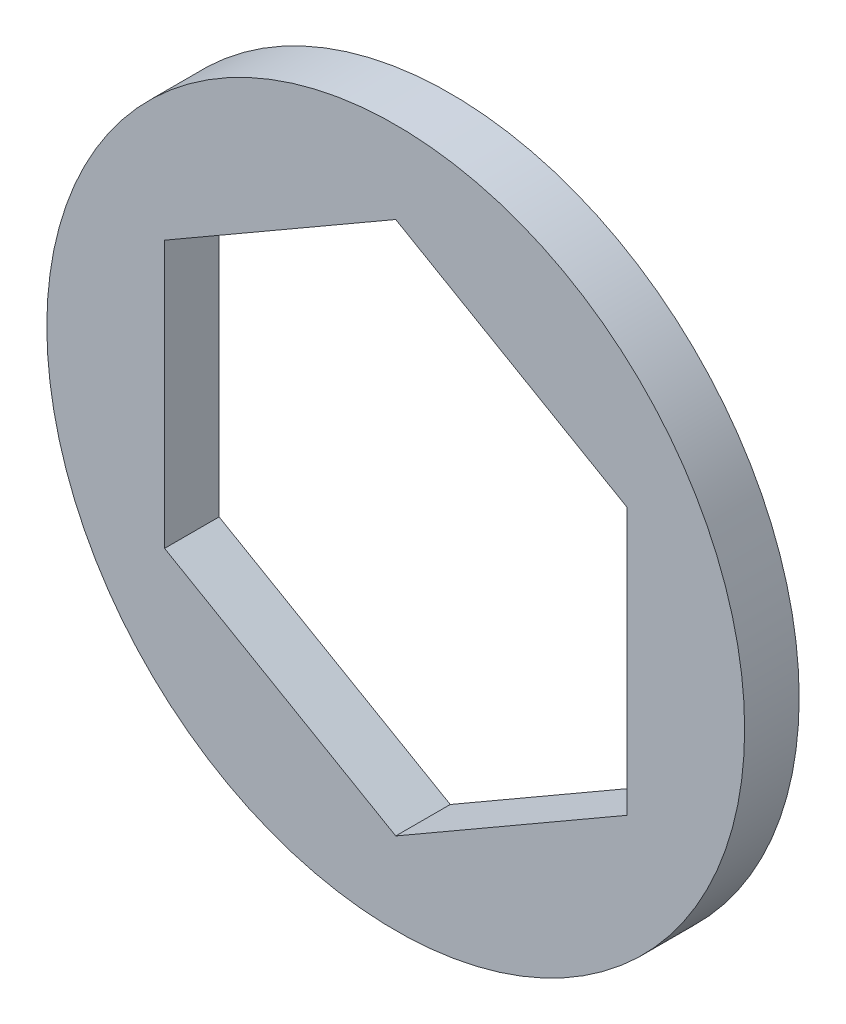
ISO-10303-21;
HEADER;
FILE_DESCRIPTION(('STEP AP214'),'2;1');
FILE_NAME('part.step','',(''),(''),'','','');
FILE_SCHEMA(('AUTOMOTIVE_DESIGN { 1 0 10303 214 1 1 1 1 }'));
ENDSEC;
DATA;
#1=APPLICATION_CONTEXT('core data for automotive mechanical design processes');
#2=APPLICATION_PROTOCOL_DEFINITION('international standard','automotive_design',2000,#1);
#3=PRODUCT_CONTEXT('',#1,'mechanical');
#4=PRODUCT('Part','Part','',(#3));
#5=PRODUCT_RELATED_PRODUCT_CATEGORY('part','',(#4));
#6=PRODUCT_DEFINITION_FORMATION('','',#4);
#7=PRODUCT_DEFINITION_CONTEXT('part definition',#1,'design');
#8=PRODUCT_DEFINITION('design','',#6,#7);
#9=PRODUCT_DEFINITION_SHAPE('','',#8);
#10=(LENGTH_UNIT() NAMED_UNIT(*) SI_UNIT(.MILLI.,.METRE.));
#11=(NAMED_UNIT(*) PLANE_ANGLE_UNIT() SI_UNIT($,.RADIAN.));
#12=(NAMED_UNIT(*) SI_UNIT($,.STERADIAN.) SOLID_ANGLE_UNIT());
#13=UNCERTAINTY_MEASURE_WITH_UNIT(LENGTH_MEASURE(1.E-05),#10,'distance_accuracy_value','');
#14=(GEOMETRIC_REPRESENTATION_CONTEXT(3) GLOBAL_UNCERTAINTY_ASSIGNED_CONTEXT((#13)) GLOBAL_UNIT_ASSIGNED_CONTEXT((#10,
#11,#12)) REPRESENTATION_CONTEXT('',''));
#15=CARTESIAN_POINT('',(0.,0.,0.));
#16=DIRECTION('',(0.,0.,1.));
#17=DIRECTION('',(1.,0.,0.));
#18=AXIS2_PLACEMENT_3D('',#15,#16,#17);
#19=CARTESIAN_POINT('',(0.,0.,0.79375));
#20=DIRECTION('',(0.,0.,1.));
#21=DIRECTION('',(1.,0.,0.));
#22=AXIS2_PLACEMENT_3D('',#19,#20,#21);
#23=PLANE('',#22);
#24=CARTESIAN_POINT('',(0.,0.,0.79375));
#25=DIRECTION('',(0.,0.,1.));
#26=DIRECTION('',(1.,0.,0.));
#27=AXIS2_PLACEMENT_3D('',#24,#25,#26);
#28=CIRCLE('',#27,10.16);
#29=CARTESIAN_POINT('',(10.16,0.,0.79375));
#30=VERTEX_POINT('',#29);
#31=EDGE_CURVE('E11',#30,#30,#28,.T.);
#32=ORIENTED_EDGE('',*,*,#31,.T.);
#33=EDGE_LOOP('',(#32));
#34=FACE_BOUND('',#33,.T.);
#35=DIRECTION('',(-0.866025403784438,-0.5,0.));
#36=VECTOR('',#35,1.);
#37=CARTESIAN_POINT('',(0.,7.77228932383074,0.79375));
#38=LINE('',#37,#36);
#39=CARTESIAN_POINT('',(0.,7.77228932383074,0.79375));
#40=VERTEX_POINT('',#39);
#41=CARTESIAN_POINT('',(-6.731,3.88614466191537,0.79375));
#42=VERTEX_POINT('',#41);
#43=EDGE_CURVE('E102',#40,#42,#38,.T.);
#44=ORIENTED_EDGE('',*,*,#43,.F.);
#45=DIRECTION('',(-0.866025403784439,0.5,0.));
#46=VECTOR('',#45,1.);
#47=CARTESIAN_POINT('',(6.731,3.88614466191537,0.79375));
#48=LINE('',#47,#46);
#49=CARTESIAN_POINT('',(6.731,3.88614466191537,0.79375));
#50=VERTEX_POINT('',#49);
#51=EDGE_CURVE('E94',#50,#40,#48,.T.);
#52=ORIENTED_EDGE('',*,*,#51,.F.);
#53=DIRECTION('',(0.,1.,0.));
#54=VECTOR('',#53,1.);
#55=CARTESIAN_POINT('',(6.731,-3.88614466191537,0.79375));
#56=LINE('',#55,#54);
#57=CARTESIAN_POINT('',(6.731,-3.88614466191537,0.79375));
#58=VERTEX_POINT('',#57);
#59=EDGE_CURVE('E122',#58,#50,#56,.T.);
#60=ORIENTED_EDGE('',*,*,#59,.F.);
#61=DIRECTION('',(0.866025403784439,0.5,0.));
#62=VECTOR('',#61,1.);
#63=CARTESIAN_POINT('',(0.,-7.77228932383074,0.79375));
#64=LINE('',#63,#62);
#65=CARTESIAN_POINT('',(0.,-7.77228932383074,0.79375));
#66=VERTEX_POINT('',#65);
#67=EDGE_CURVE('E120',#66,#58,#64,.T.);
#68=ORIENTED_EDGE('',*,*,#67,.F.);
#69=DIRECTION('',(0.866025403784439,-0.5,0.));
#70=VECTOR('',#69,1.);
#71=CARTESIAN_POINT('',(-6.731,-3.88614466191537,0.79375));
#72=LINE('',#71,#70);
#73=CARTESIAN_POINT('',(-6.731,-3.88614466191537,0.79375));
#74=VERTEX_POINT('',#73);
#75=EDGE_CURVE('E116',#74,#66,#72,.T.);
#76=ORIENTED_EDGE('',*,*,#75,.F.);
#77=DIRECTION('',(0.,-1.,0.));
#78=VECTOR('',#77,1.);
#79=CARTESIAN_POINT('',(-6.731,3.88614466191537,0.79375));
#80=LINE('',#79,#78);
#81=EDGE_CURVE('E114',#42,#74,#80,.T.);
#82=ORIENTED_EDGE('',*,*,#81,.F.);
#83=EDGE_LOOP('',(#44,#52,#60,#68,#76,#82));
#84=FACE_BOUND('',#83,.T.);
#85=ADVANCED_FACE('F41',(#34,#84),#23,.T.);
#86=CARTESIAN_POINT('',(0.,0.,-0.79375));
#87=DIRECTION('',(0.,0.,1.));
#88=DIRECTION('',(1.,0.,0.));
#89=AXIS2_PLACEMENT_3D('',#86,#87,#88);
#90=PLANE('',#89);
#91=CARTESIAN_POINT('',(0.,0.,-0.79375));
#92=DIRECTION('',(0.,0.,1.));
#93=DIRECTION('',(1.,0.,0.));
#94=AXIS2_PLACEMENT_3D('',#91,#92,#93);
#95=CIRCLE('',#94,10.16);
#96=CARTESIAN_POINT('',(10.16,0.,-0.79375));
#97=VERTEX_POINT('',#96);
#98=EDGE_CURVE('E45',#97,#97,#95,.T.);
#99=ORIENTED_EDGE('',*,*,#98,.F.);
#100=EDGE_LOOP('',(#99));
#101=FACE_BOUND('',#100,.T.);
#102=DIRECTION('',(-0.866025403784439,0.5,0.));
#103=VECTOR('',#102,1.);
#104=CARTESIAN_POINT('',(6.731,3.88614466191537,-0.79375));
#105=LINE('',#104,#103);
#106=CARTESIAN_POINT('',(6.731,3.88614466191537,-0.79375));
#107=VERTEX_POINT('',#106);
#108=CARTESIAN_POINT('',(0.,7.77228932383074,-0.79375));
#109=VERTEX_POINT('',#108);
#110=EDGE_CURVE('E64',#107,#109,#105,.T.);
#111=ORIENTED_EDGE('',*,*,#110,.T.);
#112=DIRECTION('',(-0.866025403784438,-0.5,0.));
#113=VECTOR('',#112,1.);
#114=CARTESIAN_POINT('',(0.,7.77228932383074,-0.79375));
#115=LINE('',#114,#113);
#116=CARTESIAN_POINT('',(-6.731,3.88614466191537,-0.79375));
#117=VERTEX_POINT('',#116);
#118=EDGE_CURVE('E109',#109,#117,#115,.T.);
#119=ORIENTED_EDGE('',*,*,#118,.T.);
#120=DIRECTION('',(0.,-1.,0.));
#121=VECTOR('',#120,1.);
#122=CARTESIAN_POINT('',(-6.731,3.88614466191537,-0.79375));
#123=LINE('',#122,#121);
#124=CARTESIAN_POINT('',(-6.731,-3.88614466191537,-0.79375));
#125=VERTEX_POINT('',#124);
#126=EDGE_CURVE('E126',#117,#125,#123,.T.);
#127=ORIENTED_EDGE('',*,*,#126,.T.);
#128=DIRECTION('',(0.866025403784439,-0.5,0.));
#129=VECTOR('',#128,1.);
#130=CARTESIAN_POINT('',(-6.731,-3.88614466191537,-0.79375));
#131=LINE('',#130,#129);
#132=CARTESIAN_POINT('',(0.,-7.77228932383074,-0.79375));
#133=VERTEX_POINT('',#132);
#134=EDGE_CURVE('E129',#125,#133,#131,.T.);
#135=ORIENTED_EDGE('',*,*,#134,.T.);
#136=DIRECTION('',(0.866025403784439,0.5,0.));
#137=VECTOR('',#136,1.);
#138=CARTESIAN_POINT('',(0.,-7.77228932383074,-0.79375));
#139=LINE('',#138,#137);
#140=CARTESIAN_POINT('',(6.731,-3.88614466191537,-0.79375));
#141=VERTEX_POINT('',#140);
#142=EDGE_CURVE('E132',#133,#141,#139,.T.);
#143=ORIENTED_EDGE('',*,*,#142,.T.);
#144=DIRECTION('',(0.,1.,0.));
#145=VECTOR('',#144,1.);
#146=CARTESIAN_POINT('',(6.731,-3.88614466191537,-0.79375));
#147=LINE('',#146,#145);
#148=EDGE_CURVE('E103',#141,#107,#147,.T.);
#149=ORIENTED_EDGE('',*,*,#148,.T.);
#150=EDGE_LOOP('',(#111,#119,#127,#135,#143,#149));
#151=FACE_BOUND('',#150,.T.);
#152=ADVANCED_FACE('F149',(#101,#151),#90,.F.);
#153=CARTESIAN_POINT('',(0.,0.,0.79375));
#154=DIRECTION('',(0.,0.,-1.));
#155=DIRECTION('',(-1.,0.,0.));
#156=AXIS2_PLACEMENT_3D('',#153,#154,#155);
#157=CYLINDRICAL_SURFACE('',#156,10.16);
#158=ORIENTED_EDGE('',*,*,#31,.F.);
#159=EDGE_LOOP('',(#158));
#160=FACE_BOUND('',#159,.T.);
#161=ORIENTED_EDGE('',*,*,#98,.T.);
#162=EDGE_LOOP('',(#161));
#163=FACE_BOUND('',#162,.T.);
#164=ADVANCED_FACE('F43',(#160,#163),#157,.T.);
#165=CARTESIAN_POINT('',(6.731,3.88614466191537,0.79375));
#166=DIRECTION('',(-0.5,-0.866025403784439,0.));
#167=DIRECTION('',(0.866025403784439,-0.5,0.));
#168=AXIS2_PLACEMENT_3D('',#165,#166,#167);
#169=PLANE('',#168);
#170=ORIENTED_EDGE('',*,*,#110,.F.);
#171=DIRECTION('',(0.,0.,-1.));
#172=VECTOR('',#171,1.);
#173=CARTESIAN_POINT('',(6.731,3.88614466191537,0.79375));
#174=LINE('',#173,#172);
#175=EDGE_CURVE('E98',#50,#107,#174,.T.);
#176=ORIENTED_EDGE('',*,*,#175,.F.);
#177=ORIENTED_EDGE('',*,*,#51,.T.);
#178=DIRECTION('',(0.,0.,-1.));
#179=VECTOR('',#178,1.);
#180=CARTESIAN_POINT('',(0.,7.77228932383074,0.79375));
#181=LINE('',#180,#179);
#182=EDGE_CURVE('E97',#40,#109,#181,.T.);
#183=ORIENTED_EDGE('',*,*,#182,.T.);
#184=EDGE_LOOP('',(#170,#176,#177,#183));
#185=FACE_BOUND('',#184,.T.);
#186=ADVANCED_FACE('F96',(#185),#169,.T.);
#187=CARTESIAN_POINT('',(0.,7.77228932383074,0.79375));
#188=DIRECTION('',(0.5,-0.866025403784438,0.));
#189=DIRECTION('',(0.866025403784439,0.5,0.));
#190=AXIS2_PLACEMENT_3D('',#187,#188,#189);
#191=PLANE('',#190);
#192=ORIENTED_EDGE('',*,*,#118,.F.);
#193=ORIENTED_EDGE('',*,*,#182,.F.);
#194=ORIENTED_EDGE('',*,*,#43,.T.);
#195=DIRECTION('',(0.,0.,-1.));
#196=VECTOR('',#195,1.);
#197=CARTESIAN_POINT('',(-6.731,3.88614466191537,0.79375));
#198=LINE('',#197,#196);
#199=EDGE_CURVE('E110',#42,#117,#198,.T.);
#200=ORIENTED_EDGE('',*,*,#199,.T.);
#201=EDGE_LOOP('',(#192,#193,#194,#200));
#202=FACE_BOUND('',#201,.T.);
#203=ADVANCED_FACE('F106',(#202),#191,.T.);
#204=CARTESIAN_POINT('',(-6.731,3.88614466191537,0.79375));
#205=DIRECTION('',(1.,0.,0.));
#206=DIRECTION('',(0.,1.,0.));
#207=AXIS2_PLACEMENT_3D('',#204,#205,#206);
#208=PLANE('',#207);
#209=ORIENTED_EDGE('',*,*,#126,.F.);
#210=ORIENTED_EDGE('',*,*,#199,.F.);
#211=ORIENTED_EDGE('',*,*,#81,.T.);
#212=DIRECTION('',(0.,0.,-1.));
#213=VECTOR('',#212,1.);
#214=CARTESIAN_POINT('',(-6.731,-3.88614466191537,0.79375));
#215=LINE('',#214,#213);
#216=EDGE_CURVE('E141',#74,#125,#215,.T.);
#217=ORIENTED_EDGE('',*,*,#216,.T.);
#218=EDGE_LOOP('',(#209,#210,#211,#217));
#219=FACE_BOUND('',#218,.T.);
#220=ADVANCED_FACE('F145',(#219),#208,.T.);
#221=CARTESIAN_POINT('',(-6.731,-3.88614466191537,0.79375));
#222=DIRECTION('',(0.5,0.866025403784439,0.));
#223=DIRECTION('',(-0.866025403784439,0.5,0.));
#224=AXIS2_PLACEMENT_3D('',#221,#222,#223);
#225=PLANE('',#224);
#226=ORIENTED_EDGE('',*,*,#134,.F.);
#227=ORIENTED_EDGE('',*,*,#216,.F.);
#228=ORIENTED_EDGE('',*,*,#75,.T.);
#229=DIRECTION('',(0.,0.,-1.));
#230=VECTOR('',#229,1.);
#231=CARTESIAN_POINT('',(0.,-7.77228932383074,0.79375));
#232=LINE('',#231,#230);
#233=EDGE_CURVE('E139',#66,#133,#232,.T.);
#234=ORIENTED_EDGE('',*,*,#233,.T.);
#235=EDGE_LOOP('',(#226,#227,#228,#234));
#236=FACE_BOUND('',#235,.T.);
#237=ADVANCED_FACE('F157',(#236),#225,.T.);
#238=CARTESIAN_POINT('',(0.,-7.77228932383074,0.79375));
#239=DIRECTION('',(-0.5,0.866025403784439,0.));
#240=DIRECTION('',(-0.866025403784439,-0.5,0.));
#241=AXIS2_PLACEMENT_3D('',#238,#239,#240);
#242=PLANE('',#241);
#243=ORIENTED_EDGE('',*,*,#142,.F.);
#244=ORIENTED_EDGE('',*,*,#233,.F.);
#245=ORIENTED_EDGE('',*,*,#67,.T.);
#246=DIRECTION('',(0.,0.,-1.));
#247=VECTOR('',#246,1.);
#248=CARTESIAN_POINT('',(6.731,-3.88614466191537,0.79375));
#249=LINE('',#248,#247);
#250=EDGE_CURVE('E56',#58,#141,#249,.T.);
#251=ORIENTED_EDGE('',*,*,#250,.T.);
#252=EDGE_LOOP('',(#243,#244,#245,#251));
#253=FACE_BOUND('',#252,.T.);
#254=ADVANCED_FACE('F155',(#253),#242,.T.);
#255=CARTESIAN_POINT('',(6.731,-3.88614466191537,0.79375));
#256=DIRECTION('',(-1.,0.,0.));
#257=DIRECTION('',(0.,-1.,0.));
#258=AXIS2_PLACEMENT_3D('',#255,#256,#257);
#259=PLANE('',#258);
#260=ORIENTED_EDGE('',*,*,#148,.F.);
#261=ORIENTED_EDGE('',*,*,#250,.F.);
#262=ORIENTED_EDGE('',*,*,#59,.T.);
#263=ORIENTED_EDGE('',*,*,#175,.T.);
#264=EDGE_LOOP('',(#260,#261,#262,#263));
#265=FACE_BOUND('',#264,.T.);
#266=ADVANCED_FACE('F151',(#265),#259,.T.);
#267=CLOSED_SHELL('',(#85,#152,#164,#186,#203,#220,#237,#254,#266));
#268=MANIFOLD_SOLID_BREP('B2',#267);
#269=ADVANCED_BREP_SHAPE_REPRESENTATION('',(#18,#268),#14);
#270=SHAPE_DEFINITION_REPRESENTATION(#9,#269);
ENDSEC;
END-ISO-10303-21;
